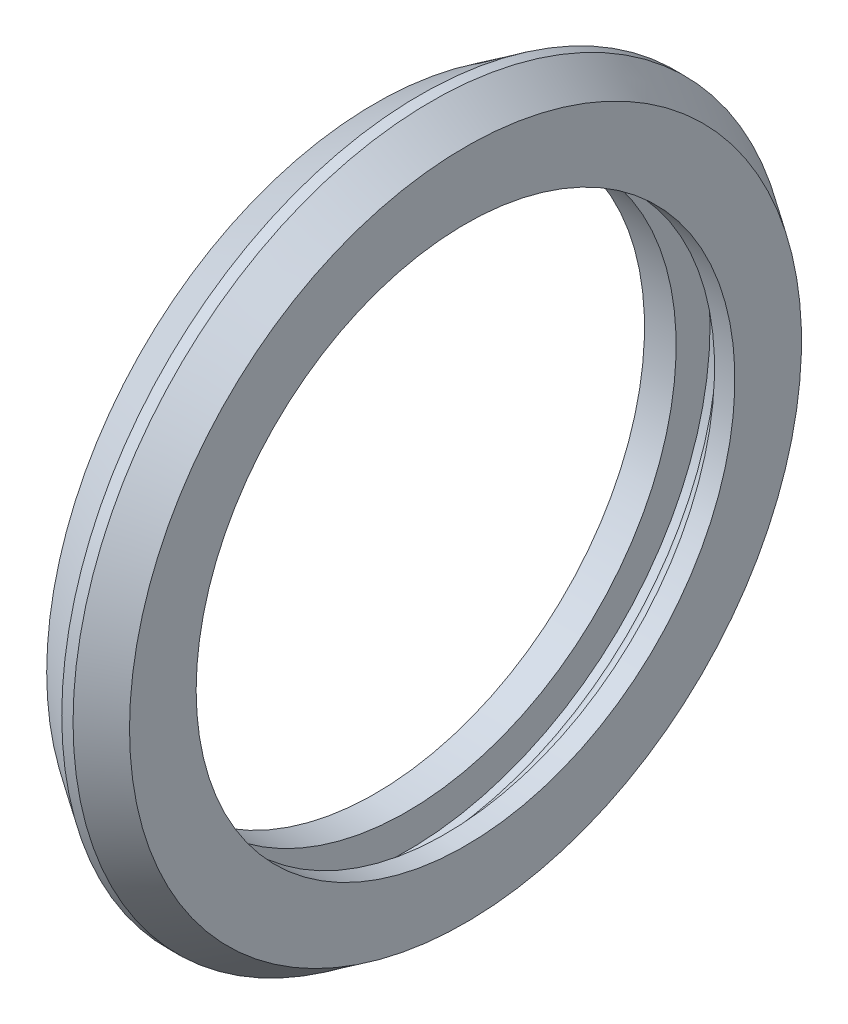
ISO-10303-21;
HEADER;
FILE_DESCRIPTION(('STEP AP214'),'2;1');
FILE_NAME('part.step','',(''),(''),'','','');
FILE_SCHEMA(('AUTOMOTIVE_DESIGN { 1 0 10303 214 1 1 1 1 }'));
ENDSEC;
DATA;
#1=APPLICATION_CONTEXT('core data for automotive mechanical design processes');
#2=APPLICATION_PROTOCOL_DEFINITION('international standard','automotive_design',2000,#1);
#3=PRODUCT_CONTEXT('',#1,'mechanical');
#4=PRODUCT('Part','Part','',(#3));
#5=PRODUCT_RELATED_PRODUCT_CATEGORY('part','',(#4));
#6=PRODUCT_DEFINITION_FORMATION('','',#4);
#7=PRODUCT_DEFINITION_CONTEXT('part definition',#1,'design');
#8=PRODUCT_DEFINITION('design','',#6,#7);
#9=PRODUCT_DEFINITION_SHAPE('','',#8);
#10=(LENGTH_UNIT() NAMED_UNIT(*) SI_UNIT(.MILLI.,.METRE.));
#11=(NAMED_UNIT(*) PLANE_ANGLE_UNIT() SI_UNIT($,.RADIAN.));
#12=(NAMED_UNIT(*) SI_UNIT($,.STERADIAN.) SOLID_ANGLE_UNIT());
#13=UNCERTAINTY_MEASURE_WITH_UNIT(LENGTH_MEASURE(1.E-05),#10,'distance_accuracy_value','');
#14=(GEOMETRIC_REPRESENTATION_CONTEXT(3) GLOBAL_UNCERTAINTY_ASSIGNED_CONTEXT((#13)) GLOBAL_UNIT_ASSIGNED_CONTEXT((#10,
#11,#12)) REPRESENTATION_CONTEXT('',''));
#15=CARTESIAN_POINT('',(0.,0.,0.));
#16=DIRECTION('',(0.,0.,1.));
#17=DIRECTION('',(1.,0.,0.));
#18=AXIS2_PLACEMENT_3D('',#15,#16,#17);
#19=CARTESIAN_POINT('',(-4.5,0.,0.));
#20=DIRECTION('',(1.,0.,0.));
#21=DIRECTION('',(0.,0.,-1.));
#22=AXIS2_PLACEMENT_3D('',#19,#20,#21);
#23=PLANE('',#22);
#24=CARTESIAN_POINT('',(-4.5,0.,0.));
#25=DIRECTION('',(-1.,0.,0.));
#26=DIRECTION('',(0.,0.,1.));
#27=AXIS2_PLACEMENT_3D('',#24,#25,#26);
#28=CIRCLE('',#27,23.85);
#29=CARTESIAN_POINT('',(-4.5,0.,23.85));
#30=VERTEX_POINT('',#29);
#31=EDGE_CURVE('E10',#30,#30,#28,.T.);
#32=ORIENTED_EDGE('',*,*,#31,.F.);
#33=EDGE_LOOP('',(#32));
#34=FACE_BOUND('',#33,.T.);
#35=CARTESIAN_POINT('',(-4.5,0.,0.));
#36=DIRECTION('',(-1.,0.,0.));
#37=DIRECTION('',(0.,0.,1.));
#38=AXIS2_PLACEMENT_3D('',#35,#36,#37);
#39=CIRCLE('',#38,29.0833333333333);
#40=CARTESIAN_POINT('',(-4.5,0.,29.0833333333333));
#41=VERTEX_POINT('',#40);
#42=EDGE_CURVE('E94',#41,#41,#39,.T.);
#43=ORIENTED_EDGE('',*,*,#42,.T.);
#44=EDGE_LOOP('',(#43));
#45=FACE_BOUND('',#44,.T.);
#46=ADVANCED_FACE('F43',(#34,#45),#23,.F.);
#47=CARTESIAN_POINT('',(0.,0.,0.));
#48=DIRECTION('',(-1.,0.,0.));
#49=DIRECTION('',(0.,0.,1.));
#50=AXIS2_PLACEMENT_3D('',#47,#48,#49);
#51=CYLINDRICAL_SURFACE('',#50,23.85);
#52=CARTESIAN_POINT('',(-1.7,0.,0.));
#53=DIRECTION('',(-1.,0.,0.));
#54=DIRECTION('',(0.,0.,1.));
#55=AXIS2_PLACEMENT_3D('',#52,#53,#54);
#56=CIRCLE('',#55,23.85);
#57=CARTESIAN_POINT('',(-1.7,0.,23.85));
#58=VERTEX_POINT('',#57);
#59=EDGE_CURVE('E50',#58,#58,#56,.T.);
#60=ORIENTED_EDGE('',*,*,#59,.F.);
#61=EDGE_LOOP('',(#60));
#62=FACE_BOUND('',#61,.T.);
#63=ORIENTED_EDGE('',*,*,#31,.T.);
#64=EDGE_LOOP('',(#63));
#65=FACE_BOUND('',#64,.T.);
#66=ADVANCED_FACE('F112',(#62,#65),#51,.F.);
#67=CARTESIAN_POINT('',(-1.7,0.,0.));
#68=DIRECTION('',(1.,0.,0.));
#69=DIRECTION('',(0.,0.,-1.));
#70=AXIS2_PLACEMENT_3D('',#67,#68,#69);
#71=PLANE('',#70);
#72=ORIENTED_EDGE('',*,*,#59,.T.);
#73=EDGE_LOOP('',(#72));
#74=FACE_BOUND('',#73,.T.);
#75=CARTESIAN_POINT('',(-1.7,0.,0.));
#76=DIRECTION('',(-1.,0.,0.));
#77=DIRECTION('',(0.,0.,1.));
#78=AXIS2_PLACEMENT_3D('',#75,#76,#77);
#79=CIRCLE('',#78,26.85);
#80=CARTESIAN_POINT('',(-1.7,0.,26.85));
#81=VERTEX_POINT('',#80);
#82=EDGE_CURVE('E55',#81,#81,#79,.T.);
#83=ORIENTED_EDGE('',*,*,#82,.F.);
#84=EDGE_LOOP('',(#83));
#85=FACE_BOUND('',#84,.T.);
#86=ADVANCED_FACE('F117',(#74,#85),#71,.T.);
#87=CARTESIAN_POINT('',(0.,0.,0.));
#88=DIRECTION('',(-1.,0.,0.));
#89=DIRECTION('',(0.,0.,1.));
#90=AXIS2_PLACEMENT_3D('',#87,#88,#89);
#91=CYLINDRICAL_SURFACE('',#90,26.85);
#92=CARTESIAN_POINT('',(-0.75,0.,0.));
#93=DIRECTION('',(-1.,0.,0.));
#94=DIRECTION('',(0.,0.,1.));
#95=AXIS2_PLACEMENT_3D('',#92,#93,#94);
#96=CIRCLE('',#95,26.85);
#97=CARTESIAN_POINT('',(-0.75,0.,26.85));
#98=VERTEX_POINT('',#97);
#99=EDGE_CURVE('E60',#98,#98,#96,.T.);
#100=ORIENTED_EDGE('',*,*,#99,.F.);
#101=EDGE_LOOP('',(#100));
#102=FACE_BOUND('',#101,.T.);
#103=ORIENTED_EDGE('',*,*,#82,.T.);
#104=EDGE_LOOP('',(#103));
#105=FACE_BOUND('',#104,.T.);
#106=ADVANCED_FACE('F122',(#102,#105),#91,.F.);
#107=CARTESIAN_POINT('',(0.,0.,0.));
#108=DIRECTION('',(-1.,0.,0.));
#109=DIRECTION('',(0.,0.,1.));
#110=AXIS2_PLACEMENT_3D('',#107,#108,#109);
#111=TOROIDAL_SURFACE('',#110,26.85,0.75);
#112=CARTESIAN_POINT('',(0.75,0.,0.));
#113=DIRECTION('',(-1.,0.,0.));
#114=DIRECTION('',(0.,0.,1.));
#115=AXIS2_PLACEMENT_3D('',#112,#113,#114);
#116=CIRCLE('',#115,26.85);
#117=CARTESIAN_POINT('',(0.75,0.,26.85));
#118=VERTEX_POINT('',#117);
#119=EDGE_CURVE('E66',#118,#118,#116,.T.);
#120=ORIENTED_EDGE('',*,*,#119,.F.);
#121=EDGE_LOOP('',(#120));
#122=FACE_BOUND('',#121,.T.);
#123=ORIENTED_EDGE('',*,*,#99,.T.);
#124=EDGE_LOOP('',(#123));
#125=FACE_BOUND('',#124,.T.);
#126=ADVANCED_FACE('F125',(#122,#125),#111,.T.);
#127=CARTESIAN_POINT('',(1.7,0.,0.));
#128=DIRECTION('',(-1.,0.,0.));
#129=DIRECTION('',(0.,0.,1.));
#130=AXIS2_PLACEMENT_3D('',#127,#128,#129);
#131=CIRCLE('',#130,26.85);
#132=CARTESIAN_POINT('',(1.7,0.,26.85));
#133=VERTEX_POINT('',#132);
#134=EDGE_CURVE('E70',#133,#133,#131,.T.);
#135=ORIENTED_EDGE('',*,*,#134,.F.);
#136=EDGE_LOOP('',(#135));
#137=FACE_BOUND('',#136,.T.);
#138=ORIENTED_EDGE('',*,*,#119,.T.);
#139=EDGE_LOOP('',(#138));
#140=FACE_BOUND('',#139,.T.);
#141=ADVANCED_FACE('F128',(#137,#140),#91,.F.);
#142=CARTESIAN_POINT('',(1.7,0.,0.));
#143=DIRECTION('',(1.,0.,0.));
#144=DIRECTION('',(0.,0.,-1.));
#145=AXIS2_PLACEMENT_3D('',#142,#143,#144);
#146=PLANE('',#145);
#147=CARTESIAN_POINT('',(1.7,0.,0.));
#148=DIRECTION('',(-1.,0.,0.));
#149=DIRECTION('',(0.,0.,1.));
#150=AXIS2_PLACEMENT_3D('',#147,#148,#149);
#151=CIRCLE('',#150,23.85);
#152=CARTESIAN_POINT('',(1.7,0.,23.85));
#153=VERTEX_POINT('',#152);
#154=EDGE_CURVE('E74',#153,#153,#151,.T.);
#155=ORIENTED_EDGE('',*,*,#154,.F.);
#156=EDGE_LOOP('',(#155));
#157=FACE_BOUND('',#156,.T.);
#158=ORIENTED_EDGE('',*,*,#134,.T.);
#159=EDGE_LOOP('',(#158));
#160=FACE_BOUND('',#159,.T.);
#161=ADVANCED_FACE('F132',(#157,#160),#146,.F.);
#162=CARTESIAN_POINT('',(0.,0.,0.));
#163=DIRECTION('',(-1.,0.,0.));
#164=DIRECTION('',(0.,0.,1.));
#165=AXIS2_PLACEMENT_3D('',#162,#163,#164);
#166=CYLINDRICAL_SURFACE('',#165,23.85);
#167=ORIENTED_EDGE('',*,*,#154,.T.);
#168=EDGE_LOOP('',(#167));
#169=FACE_BOUND('',#168,.T.);
#170=CARTESIAN_POINT('',(3.5,0.,0.));
#171=DIRECTION('',(-1.,0.,0.));
#172=DIRECTION('',(0.,0.,1.));
#173=AXIS2_PLACEMENT_3D('',#170,#171,#172);
#174=CIRCLE('',#173,23.85);
#175=CARTESIAN_POINT('',(3.5,0.,23.85));
#176=VERTEX_POINT('',#175);
#177=EDGE_CURVE('E78',#176,#176,#174,.T.);
#178=ORIENTED_EDGE('',*,*,#177,.F.);
#179=EDGE_LOOP('',(#178));
#180=FACE_BOUND('',#179,.T.);
#181=ADVANCED_FACE('F136',(#169,#180),#166,.F.);
#182=CARTESIAN_POINT('',(3.5,0.,0.));
#183=DIRECTION('',(-1.,0.,0.));
#184=DIRECTION('',(0.,0.,1.));
#185=AXIS2_PLACEMENT_3D('',#182,#183,#184);
#186=PLANE('',#185);
#187=CARTESIAN_POINT('',(3.5,0.,0.));
#188=DIRECTION('',(-1.,0.,0.));
#189=DIRECTION('',(0.,0.,1.));
#190=AXIS2_PLACEMENT_3D('',#187,#188,#189);
#191=CIRCLE('',#190,29.75);
#192=CARTESIAN_POINT('',(3.5,0.,29.75));
#193=VERTEX_POINT('',#192);
#194=EDGE_CURVE('E82',#193,#193,#191,.T.);
#195=ORIENTED_EDGE('',*,*,#194,.F.);
#196=EDGE_LOOP('',(#195));
#197=FACE_BOUND('',#196,.T.);
#198=ORIENTED_EDGE('',*,*,#177,.T.);
#199=EDGE_LOOP('',(#198));
#200=FACE_BOUND('',#199,.T.);
#201=ADVANCED_FACE('F140',(#197,#200),#186,.F.);
#202=CARTESIAN_POINT('',(0.499999999999999,0.,0.));
#203=DIRECTION('',(-1.,0.,0.));
#204=DIRECTION('',(0.,0.,1.));
#205=AXIS2_PLACEMENT_3D('',#202,#203,#204);
#206=CONICAL_SURFACE('',#205,31.75,0.588002603547568);
#207=ORIENTED_EDGE('',*,*,#194,.T.);
#208=EDGE_LOOP('',(#207));
#209=FACE_BOUND('',#208,.T.);
#210=CARTESIAN_POINT('',(0.499999999999999,0.,0.));
#211=DIRECTION('',(-1.,0.,0.));
#212=DIRECTION('',(0.,0.,1.));
#213=AXIS2_PLACEMENT_3D('',#210,#211,#212);
#214=CIRCLE('',#213,31.75);
#215=CARTESIAN_POINT('',(0.499999999999999,0.,31.75));
#216=VERTEX_POINT('',#215);
#217=EDGE_CURVE('E86',#216,#216,#214,.T.);
#218=ORIENTED_EDGE('',*,*,#217,.F.);
#219=EDGE_LOOP('',(#218));
#220=FACE_BOUND('',#219,.T.);
#221=ADVANCED_FACE('F108',(#209,#220),#206,.T.);
#222=CARTESIAN_POINT('',(0.,0.,0.));
#223=DIRECTION('',(-1.,0.,0.));
#224=DIRECTION('',(0.,0.,1.));
#225=AXIS2_PLACEMENT_3D('',#222,#223,#224);
#226=CYLINDRICAL_SURFACE('',#225,31.75);
#227=ORIENTED_EDGE('',*,*,#217,.T.);
#228=EDGE_LOOP('',(#227));
#229=FACE_BOUND('',#228,.T.);
#230=CARTESIAN_POINT('',(-0.5,0.,0.));
#231=DIRECTION('',(-1.,0.,0.));
#232=DIRECTION('',(0.,0.,1.));
#233=AXIS2_PLACEMENT_3D('',#230,#231,#232);
#234=CIRCLE('',#233,31.75);
#235=CARTESIAN_POINT('',(-0.5,0.,31.75));
#236=VERTEX_POINT('',#235);
#237=EDGE_CURVE('E90',#236,#236,#234,.T.);
#238=ORIENTED_EDGE('',*,*,#237,.F.);
#239=EDGE_LOOP('',(#238));
#240=FACE_BOUND('',#239,.T.);
#241=ADVANCED_FACE('F102',(#229,#240),#226,.T.);
#242=CARTESIAN_POINT('',(-4.5,0.,0.));
#243=DIRECTION('',(1.,0.,0.));
#244=DIRECTION('',(0.,0.,-1.));
#245=AXIS2_PLACEMENT_3D('',#242,#243,#244);
#246=CONICAL_SURFACE('',#245,29.0833333333333,0.588002603547567);
#247=ORIENTED_EDGE('',*,*,#237,.T.);
#248=EDGE_LOOP('',(#247));
#249=FACE_BOUND('',#248,.T.);
#250=ORIENTED_EDGE('',*,*,#42,.F.);
#251=EDGE_LOOP('',(#250));
#252=FACE_BOUND('',#251,.T.);
#253=ADVANCED_FACE('F100',(#249,#252),#246,.T.);
#254=CLOSED_SHELL('',(#46,#66,#86,#106,#126,#141,#161,#181,#201,#221,#241,#253));
#255=MANIFOLD_SOLID_BREP('B2',#254);
#256=ADVANCED_BREP_SHAPE_REPRESENTATION('',(#18,#255),#14);
#257=SHAPE_DEFINITION_REPRESENTATION(#9,#256);
ENDSEC;
END-ISO-10303-21;
